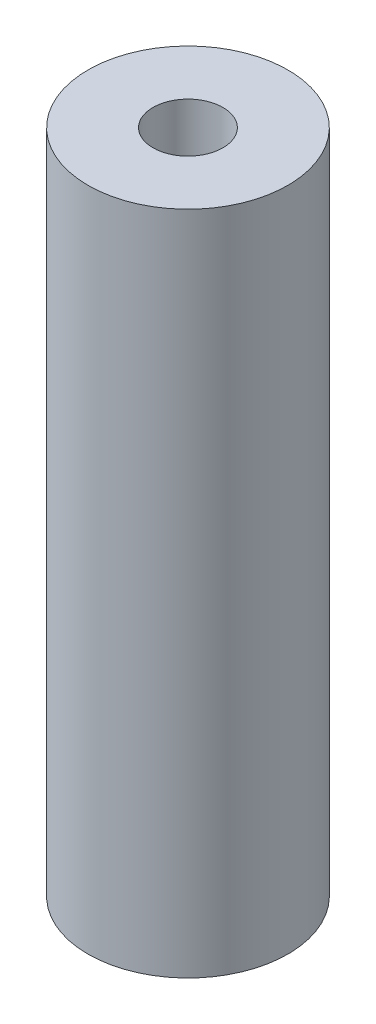
ISO-10303-21;
HEADER;
FILE_DESCRIPTION(('STEP AP214'),'2;1');
FILE_NAME('part.step','',(''),(''),'','','');
FILE_SCHEMA(('AUTOMOTIVE_DESIGN { 1 0 10303 214 1 1 1 1 }'));
ENDSEC;
DATA;
#1=APPLICATION_CONTEXT('core data for automotive mechanical design processes');
#2=APPLICATION_PROTOCOL_DEFINITION('international standard','automotive_design',2000,#1);
#3=PRODUCT_CONTEXT('',#1,'mechanical');
#4=PRODUCT('Part','Part','',(#3));
#5=PRODUCT_RELATED_PRODUCT_CATEGORY('part','',(#4));
#6=PRODUCT_DEFINITION_FORMATION('','',#4);
#7=PRODUCT_DEFINITION_CONTEXT('part definition',#1,'design');
#8=PRODUCT_DEFINITION('design','',#6,#7);
#9=PRODUCT_DEFINITION_SHAPE('','',#8);
#10=(LENGTH_UNIT() NAMED_UNIT(*) SI_UNIT(.MILLI.,.METRE.));
#11=(NAMED_UNIT(*) PLANE_ANGLE_UNIT() SI_UNIT($,.RADIAN.));
#12=(NAMED_UNIT(*) SI_UNIT($,.STERADIAN.) SOLID_ANGLE_UNIT());
#13=UNCERTAINTY_MEASURE_WITH_UNIT(LENGTH_MEASURE(1.E-05),#10,'distance_accuracy_value','');
#14=(GEOMETRIC_REPRESENTATION_CONTEXT(3) GLOBAL_UNCERTAINTY_ASSIGNED_CONTEXT((#13)) GLOBAL_UNIT_ASSIGNED_CONTEXT((#10,
#11,#12)) REPRESENTATION_CONTEXT('',''));
#15=CARTESIAN_POINT('',(0.,0.,0.));
#16=DIRECTION('',(0.,0.,1.));
#17=DIRECTION('',(1.,0.,0.));
#18=AXIS2_PLACEMENT_3D('',#15,#16,#17);
#19=CARTESIAN_POINT('',(0.,33.3,0.));
#20=DIRECTION('',(0.,1.,0.));
#21=DIRECTION('',(0.,0.,1.));
#22=AXIS2_PLACEMENT_3D('',#19,#20,#21);
#23=PLANE('',#22);
#24=CARTESIAN_POINT('',(0.,33.3,0.));
#25=DIRECTION('',(0.,1.,0.));
#26=DIRECTION('',(0.,0.,1.));
#27=AXIS2_PLACEMENT_3D('',#24,#25,#26);
#28=CIRCLE('',#27,5.);
#29=CARTESIAN_POINT('',(0.,33.3,5.));
#30=VERTEX_POINT('',#29);
#31=EDGE_CURVE('E10',#30,#30,#28,.T.);
#32=ORIENTED_EDGE('',*,*,#31,.T.);
#33=EDGE_LOOP('',(#32));
#34=FACE_BOUND('',#33,.T.);
#35=CARTESIAN_POINT('',(0.,33.3,0.));
#36=DIRECTION('',(0.,1.,0.));
#37=DIRECTION('',(0.,0.,1.));
#38=AXIS2_PLACEMENT_3D('',#35,#36,#37);
#39=CIRCLE('',#38,1.75);
#40=CARTESIAN_POINT('',(0.,33.3,1.75));
#41=VERTEX_POINT('',#40);
#42=EDGE_CURVE('E46',#41,#41,#39,.T.);
#43=ORIENTED_EDGE('',*,*,#42,.F.);
#44=EDGE_LOOP('',(#43));
#45=FACE_BOUND('',#44,.T.);
#46=ADVANCED_FACE('F35',(#34,#45),#23,.T.);
#47=CARTESIAN_POINT('',(0.,0.,0.));
#48=DIRECTION('',(0.,1.,0.));
#49=DIRECTION('',(0.,0.,1.));
#50=AXIS2_PLACEMENT_3D('',#47,#48,#49);
#51=PLANE('',#50);
#52=CARTESIAN_POINT('',(0.,0.,0.));
#53=DIRECTION('',(0.,1.,0.));
#54=DIRECTION('',(0.,0.,1.));
#55=AXIS2_PLACEMENT_3D('',#52,#53,#54);
#56=CIRCLE('',#55,5.);
#57=CARTESIAN_POINT('',(0.,0.,5.));
#58=VERTEX_POINT('',#57);
#59=EDGE_CURVE('E39',#58,#58,#56,.T.);
#60=ORIENTED_EDGE('',*,*,#59,.F.);
#61=EDGE_LOOP('',(#60));
#62=FACE_BOUND('',#61,.T.);
#63=CARTESIAN_POINT('',(0.,0.,0.));
#64=DIRECTION('',(0.,1.,0.));
#65=DIRECTION('',(0.,0.,1.));
#66=AXIS2_PLACEMENT_3D('',#63,#64,#65);
#67=CIRCLE('',#66,1.75);
#68=CARTESIAN_POINT('',(0.,0.,1.75));
#69=VERTEX_POINT('',#68);
#70=EDGE_CURVE('E48',#69,#69,#67,.T.);
#71=ORIENTED_EDGE('',*,*,#70,.T.);
#72=EDGE_LOOP('',(#71));
#73=FACE_BOUND('',#72,.T.);
#74=ADVANCED_FACE('F58',(#62,#73),#51,.F.);
#75=CARTESIAN_POINT('',(0.,33.3,0.));
#76=DIRECTION('',(0.,-1.,0.));
#77=DIRECTION('',(0.,0.,-1.));
#78=AXIS2_PLACEMENT_3D('',#75,#76,#77);
#79=CYLINDRICAL_SURFACE('',#78,5.);
#80=ORIENTED_EDGE('',*,*,#31,.F.);
#81=EDGE_LOOP('',(#80));
#82=FACE_BOUND('',#81,.T.);
#83=ORIENTED_EDGE('',*,*,#59,.T.);
#84=EDGE_LOOP('',(#83));
#85=FACE_BOUND('',#84,.T.);
#86=ADVANCED_FACE('F37',(#82,#85),#79,.T.);
#87=CARTESIAN_POINT('',(0.,33.3,0.));
#88=DIRECTION('',(0.,-1.,0.));
#89=DIRECTION('',(0.,0.,-1.));
#90=AXIS2_PLACEMENT_3D('',#87,#88,#89);
#91=CYLINDRICAL_SURFACE('',#90,1.75);
#92=ORIENTED_EDGE('',*,*,#42,.T.);
#93=EDGE_LOOP('',(#92));
#94=FACE_BOUND('',#93,.T.);
#95=ORIENTED_EDGE('',*,*,#70,.F.);
#96=EDGE_LOOP('',(#95));
#97=FACE_BOUND('',#96,.T.);
#98=ADVANCED_FACE('F54',(#94,#97),#91,.F.);
#99=CLOSED_SHELL('',(#46,#74,#86,#98));
#100=MANIFOLD_SOLID_BREP('B2',#99);
#101=ADVANCED_BREP_SHAPE_REPRESENTATION('',(#18,#100),#14);
#102=SHAPE_DEFINITION_REPRESENTATION(#9,#101);
ENDSEC;
END-ISO-10303-21;
